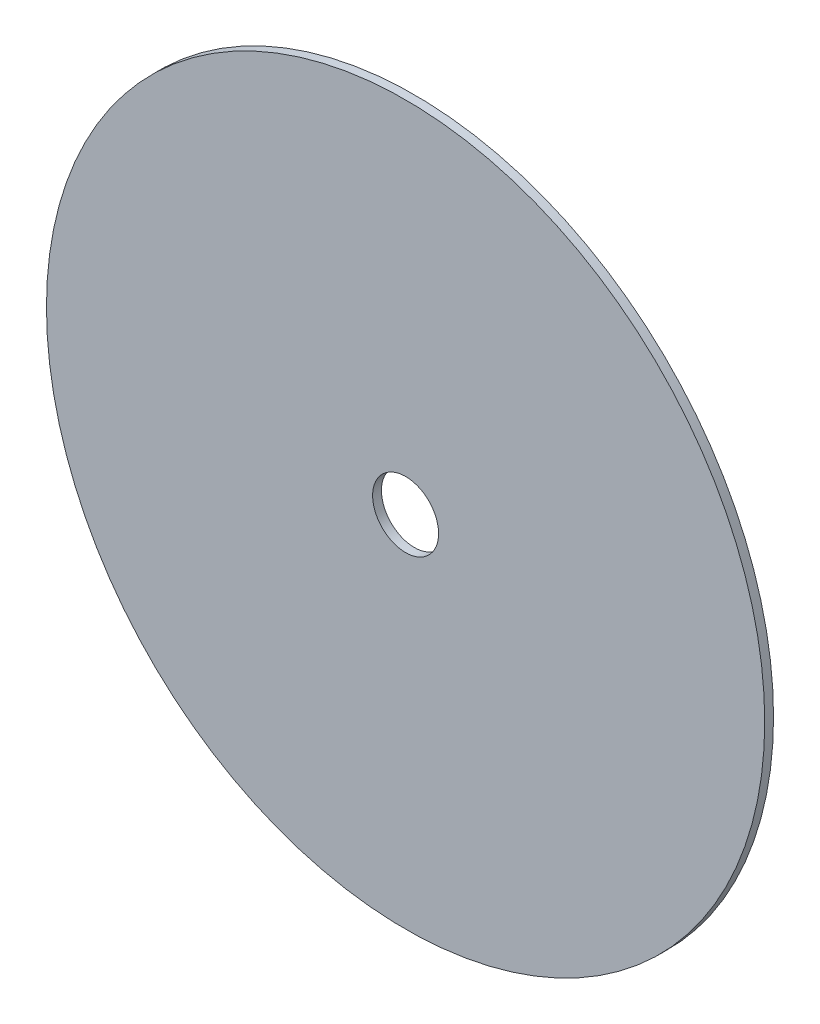
ISO-10303-21;
HEADER;
FILE_DESCRIPTION(('STEP AP214'),'2;1');
FILE_NAME('part.step','',(''),(''),'','','');
FILE_SCHEMA(('AUTOMOTIVE_DESIGN { 1 0 10303 214 1 1 1 1 }'));
ENDSEC;
DATA;
#1=APPLICATION_CONTEXT('core data for automotive mechanical design processes');
#2=APPLICATION_PROTOCOL_DEFINITION('international standard','automotive_design',2000,#1);
#3=PRODUCT_CONTEXT('',#1,'mechanical');
#4=PRODUCT('Part','Part','',(#3));
#5=PRODUCT_RELATED_PRODUCT_CATEGORY('part','',(#4));
#6=PRODUCT_DEFINITION_FORMATION('','',#4);
#7=PRODUCT_DEFINITION_CONTEXT('part definition',#1,'design');
#8=PRODUCT_DEFINITION('design','',#6,#7);
#9=PRODUCT_DEFINITION_SHAPE('','',#8);
#10=(LENGTH_UNIT() NAMED_UNIT(*) SI_UNIT(.MILLI.,.METRE.));
#11=(NAMED_UNIT(*) PLANE_ANGLE_UNIT() SI_UNIT($,.RADIAN.));
#12=(NAMED_UNIT(*) SI_UNIT($,.STERADIAN.) SOLID_ANGLE_UNIT());
#13=UNCERTAINTY_MEASURE_WITH_UNIT(LENGTH_MEASURE(1.E-05),#10,'distance_accuracy_value','');
#14=(GEOMETRIC_REPRESENTATION_CONTEXT(3) GLOBAL_UNCERTAINTY_ASSIGNED_CONTEXT((#13)) GLOBAL_UNIT_ASSIGNED_CONTEXT((#10,
#11,#12)) REPRESENTATION_CONTEXT('',''));
#15=CARTESIAN_POINT('',(0.,0.,0.));
#16=DIRECTION('',(0.,0.,1.));
#17=DIRECTION('',(1.,0.,0.));
#18=AXIS2_PLACEMENT_3D('',#15,#16,#17);
#19=CARTESIAN_POINT('',(0.,0.,0.3));
#20=DIRECTION('',(0.,0.,-1.));
#21=DIRECTION('',(-1.,0.,0.));
#22=AXIS2_PLACEMENT_3D('',#19,#20,#21);
#23=CYLINDRICAL_SURFACE('',#22,12.25);
#24=CARTESIAN_POINT('',(0.,0.,0.3));
#25=DIRECTION('',(0.,0.,1.));
#26=DIRECTION('',(1.,0.,0.));
#27=AXIS2_PLACEMENT_3D('',#24,#25,#26);
#28=CIRCLE('',#27,12.25);
#29=CARTESIAN_POINT('',(12.25,0.,0.3));
#30=VERTEX_POINT('',#29);
#31=EDGE_CURVE('E10',#30,#30,#28,.T.);
#32=ORIENTED_EDGE('',*,*,#31,.F.);
#33=EDGE_LOOP('',(#32));
#34=FACE_BOUND('',#33,.T.);
#35=CARTESIAN_POINT('',(0.,0.,0.));
#36=DIRECTION('',(0.,0.,1.));
#37=DIRECTION('',(1.,0.,0.));
#38=AXIS2_PLACEMENT_3D('',#35,#36,#37);
#39=CIRCLE('',#38,12.25);
#40=CARTESIAN_POINT('',(12.25,0.,0.));
#41=VERTEX_POINT('',#40);
#42=EDGE_CURVE('E35',#41,#41,#39,.T.);
#43=ORIENTED_EDGE('',*,*,#42,.T.);
#44=EDGE_LOOP('',(#43));
#45=FACE_BOUND('',#44,.T.);
#46=ADVANCED_FACE('F32',(#34,#45),#23,.T.);
#47=CARTESIAN_POINT('',(0.,0.,0.3));
#48=DIRECTION('',(0.,0.,1.));
#49=DIRECTION('',(1.,0.,0.));
#50=AXIS2_PLACEMENT_3D('',#47,#48,#49);
#51=PLANE('',#50);
#52=CARTESIAN_POINT('',(0.,0.,0.3));
#53=DIRECTION('',(0.,0.,1.));
#54=DIRECTION('',(1.,0.,0.));
#55=AXIS2_PLACEMENT_3D('',#52,#53,#54);
#56=CIRCLE('',#55,1.125);
#57=CARTESIAN_POINT('',(1.125,0.,0.3));
#58=VERTEX_POINT('',#57);
#59=EDGE_CURVE('E44',#58,#58,#56,.T.);
#60=ORIENTED_EDGE('',*,*,#59,.F.);
#61=EDGE_LOOP('',(#60));
#62=FACE_BOUND('',#61,.T.);
#63=ORIENTED_EDGE('',*,*,#31,.T.);
#64=EDGE_LOOP('',(#63));
#65=FACE_BOUND('',#64,.T.);
#66=ADVANCED_FACE('F59',(#62,#65),#51,.T.);
#67=CARTESIAN_POINT('',(0.,0.,0.));
#68=DIRECTION('',(0.,0.,1.));
#69=DIRECTION('',(1.,0.,0.));
#70=AXIS2_PLACEMENT_3D('',#67,#68,#69);
#71=PLANE('',#70);
#72=CARTESIAN_POINT('',(0.,0.,0.));
#73=DIRECTION('',(0.,0.,1.));
#74=DIRECTION('',(1.,0.,0.));
#75=AXIS2_PLACEMENT_3D('',#72,#73,#74);
#76=CIRCLE('',#75,1.125);
#77=CARTESIAN_POINT('',(1.125,0.,0.));
#78=VERTEX_POINT('',#77);
#79=EDGE_CURVE('E42',#78,#78,#76,.T.);
#80=ORIENTED_EDGE('',*,*,#79,.T.);
#81=EDGE_LOOP('',(#80));
#82=FACE_BOUND('',#81,.T.);
#83=ORIENTED_EDGE('',*,*,#42,.F.);
#84=EDGE_LOOP('',(#83));
#85=FACE_BOUND('',#84,.T.);
#86=ADVANCED_FACE('F50',(#82,#85),#71,.F.);
#87=CARTESIAN_POINT('',(0.,0.,0.));
#88=DIRECTION('',(0.,0.,1.));
#89=DIRECTION('',(1.,0.,0.));
#90=AXIS2_PLACEMENT_3D('',#87,#88,#89);
#91=CYLINDRICAL_SURFACE('',#90,1.125);
#92=ORIENTED_EDGE('',*,*,#79,.F.);
#93=EDGE_LOOP('',(#92));
#94=FACE_BOUND('',#93,.T.);
#95=ORIENTED_EDGE('',*,*,#59,.T.);
#96=EDGE_LOOP('',(#95));
#97=FACE_BOUND('',#96,.T.);
#98=ADVANCED_FACE('F53',(#94,#97),#91,.F.);
#99=CLOSED_SHELL('',(#46,#66,#86,#98));
#100=MANIFOLD_SOLID_BREP('B2',#99);
#101=ADVANCED_BREP_SHAPE_REPRESENTATION('',(#18,#100),#14);
#102=SHAPE_DEFINITION_REPRESENTATION(#9,#101);
ENDSEC;
END-ISO-10303-21;
